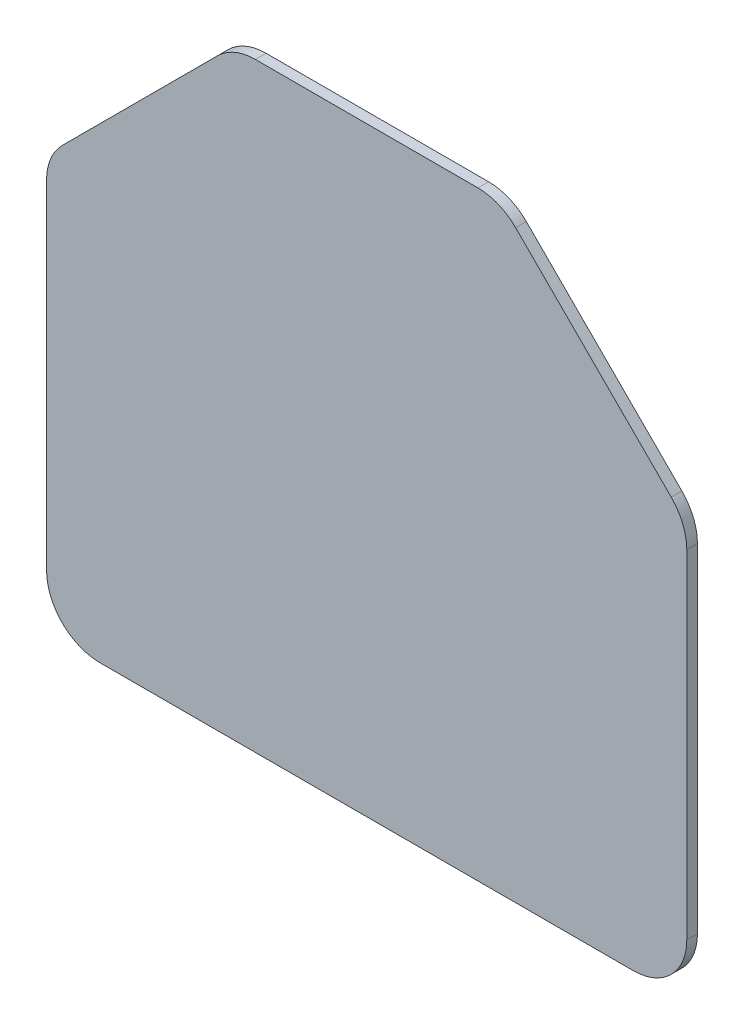
ISO-10303-21;
HEADER;
FILE_DESCRIPTION(('STEP AP214'),'2;1');
FILE_NAME('part.step','',(''),(''),'','','');
FILE_SCHEMA(('AUTOMOTIVE_DESIGN { 1 0 10303 214 1 1 1 1 }'));
ENDSEC;
DATA;
#1=APPLICATION_CONTEXT('core data for automotive mechanical design processes');
#2=APPLICATION_PROTOCOL_DEFINITION('international standard','automotive_design',2000,#1);
#3=PRODUCT_CONTEXT('',#1,'mechanical');
#4=PRODUCT('Part','Part','',(#3));
#5=PRODUCT_RELATED_PRODUCT_CATEGORY('part','',(#4));
#6=PRODUCT_DEFINITION_FORMATION('','',#4);
#7=PRODUCT_DEFINITION_CONTEXT('part definition',#1,'design');
#8=PRODUCT_DEFINITION('design','',#6,#7);
#9=PRODUCT_DEFINITION_SHAPE('','',#8);
#10=(LENGTH_UNIT() NAMED_UNIT(*) SI_UNIT(.MILLI.,.METRE.));
#11=(NAMED_UNIT(*) PLANE_ANGLE_UNIT() SI_UNIT($,.RADIAN.));
#12=(NAMED_UNIT(*) SI_UNIT($,.STERADIAN.) SOLID_ANGLE_UNIT());
#13=UNCERTAINTY_MEASURE_WITH_UNIT(LENGTH_MEASURE(1.E-05),#10,'distance_accuracy_value','');
#14=(GEOMETRIC_REPRESENTATION_CONTEXT(3) GLOBAL_UNCERTAINTY_ASSIGNED_CONTEXT((#13)) GLOBAL_UNIT_ASSIGNED_CONTEXT((#10,
#11,#12)) REPRESENTATION_CONTEXT('',''));
#15=CARTESIAN_POINT('',(0.,0.,0.));
#16=DIRECTION('',(0.,0.,1.));
#17=DIRECTION('',(1.,0.,0.));
#18=AXIS2_PLACEMENT_3D('',#15,#16,#17);
#19=CARTESIAN_POINT('',(73.5057465651856,239.089488009277,4.));
#20=DIRECTION('',(0.,0.,-1.));
#21=DIRECTION('',(-1.,0.,0.));
#22=AXIS2_PLACEMENT_3D('',#19,#20,#21);
#23=CYLINDRICAL_SURFACE('',#22,20.);
#24=CARTESIAN_POINT('',(73.5057465651856,239.089488009277,0.));
#25=DIRECTION('',(0.,0.,1.));
#26=DIRECTION('',(1.,0.,0.));
#27=AXIS2_PLACEMENT_3D('',#24,#25,#26);
#28=CIRCLE('',#27,20.);
#29=CARTESIAN_POINT('',(73.5057465651857,259.089488009277,0.));
#30=VERTEX_POINT('',#29);
#31=CARTESIAN_POINT('',(59.3636109414546,253.231623633008,0.));
#32=VERTEX_POINT('',#31);
#33=EDGE_CURVE('E154',#30,#32,#28,.T.);
#34=ORIENTED_EDGE('',*,*,#33,.T.);
#35=DIRECTION('',(0.,0.,-1.));
#36=VECTOR('',#35,1.);
#37=CARTESIAN_POINT('',(59.3636109414546,253.231623633008,4.));
#38=LINE('',#37,#36);
#39=CARTESIAN_POINT('',(59.3636109414546,253.231623633008,4.));
#40=VERTEX_POINT('',#39);
#41=EDGE_CURVE('E11',#40,#32,#38,.T.);
#42=ORIENTED_EDGE('',*,*,#41,.F.);
#43=CARTESIAN_POINT('',(73.5057465651856,239.089488009277,4.));
#44=DIRECTION('',(0.,0.,1.));
#45=DIRECTION('',(1.,0.,0.));
#46=AXIS2_PLACEMENT_3D('',#43,#44,#45);
#47=CIRCLE('',#46,20.);
#48=CARTESIAN_POINT('',(73.5057465651857,259.089488009277,4.));
#49=VERTEX_POINT('',#48);
#50=EDGE_CURVE('E176',#49,#40,#47,.T.);
#51=ORIENTED_EDGE('',*,*,#50,.F.);
#52=DIRECTION('',(0.,0.,-1.));
#53=VECTOR('',#52,1.);
#54=CARTESIAN_POINT('',(73.5057465651857,259.089488009277,4.));
#55=LINE('',#54,#53);
#56=EDGE_CURVE('E150',#49,#30,#55,.T.);
#57=ORIENTED_EDGE('',*,*,#56,.T.);
#58=EDGE_LOOP('',(#34,#42,#51,#57));
#59=FACE_BOUND('',#58,.T.);
#60=ADVANCED_FACE('F34',(#59),#23,.T.);
#61=CARTESIAN_POINT('',(1.07933969399285,194.947352385546,4.));
#62=DIRECTION('',(0.707106781186547,-0.707106781186548,0.));
#63=DIRECTION('',(0.707106781186548,0.707106781186547,0.));
#64=AXIS2_PLACEMENT_3D('',#61,#62,#63);
#65=PLANE('',#64);
#66=DIRECTION('',(-0.707106781186548,-0.707106781186547,0.));
#67=VECTOR('',#66,1.);
#68=CARTESIAN_POINT('',(1.07933969399285,194.947352385546,0.));
#69=LINE('',#68,#67);
#70=CARTESIAN_POINT('',(1.07933969399284,194.947352385546,0.));
#71=VERTEX_POINT('',#70);
#72=EDGE_CURVE('E157',#32,#71,#69,.T.);
#73=ORIENTED_EDGE('',*,*,#72,.T.);
#74=DIRECTION('',(0.,0.,-1.));
#75=VECTOR('',#74,1.);
#76=CARTESIAN_POINT('',(1.07933969399284,194.947352385546,4.));
#77=LINE('',#76,#75);
#78=CARTESIAN_POINT('',(1.07933969399284,194.947352385546,4.));
#79=VERTEX_POINT('',#78);
#80=EDGE_CURVE('E42',#79,#71,#77,.T.);
#81=ORIENTED_EDGE('',*,*,#80,.F.);
#82=DIRECTION('',(-0.707106781186548,-0.707106781186547,0.));
#83=VECTOR('',#82,1.);
#84=CARTESIAN_POINT('',(1.07933969399285,194.947352385546,4.));
#85=LINE('',#84,#83);
#86=EDGE_CURVE('E105',#40,#79,#85,.T.);
#87=ORIENTED_EDGE('',*,*,#86,.F.);
#88=ORIENTED_EDGE('',*,*,#41,.T.);
#89=EDGE_LOOP('',(#73,#81,#87,#88));
#90=FACE_BOUND('',#89,.T.);
#91=ADVANCED_FACE('F254',(#90),#65,.F.);
#92=CARTESIAN_POINT('',(15.2214753177237,180.805216761815,4.));
#93=DIRECTION('',(0.,0.,-1.));
#94=DIRECTION('',(-1.,0.,0.));
#95=AXIS2_PLACEMENT_3D('',#92,#93,#94);
#96=CYLINDRICAL_SURFACE('',#95,20.);
#97=CARTESIAN_POINT('',(15.2214753177237,180.805216761815,0.));
#98=DIRECTION('',(0.,0.,1.));
#99=DIRECTION('',(1.,0.,0.));
#100=AXIS2_PLACEMENT_3D('',#97,#98,#99);
#101=CIRCLE('',#100,20.);
#102=CARTESIAN_POINT('',(-4.77852468227626,180.805216761815,0.));
#103=VERTEX_POINT('',#102);
#104=EDGE_CURVE('E159',#71,#103,#101,.T.);
#105=ORIENTED_EDGE('',*,*,#104,.T.);
#106=DIRECTION('',(0.,0.,-1.));
#107=VECTOR('',#106,1.);
#108=CARTESIAN_POINT('',(-4.77852468227626,180.805216761815,4.));
#109=LINE('',#108,#107);
#110=CARTESIAN_POINT('',(-4.77852468227626,180.805216761815,4.));
#111=VERTEX_POINT('',#110);
#112=EDGE_CURVE('E195',#111,#103,#109,.T.);
#113=ORIENTED_EDGE('',*,*,#112,.F.);
#114=CARTESIAN_POINT('',(15.2214753177237,180.805216761815,4.));
#115=DIRECTION('',(0.,0.,1.));
#116=DIRECTION('',(1.,0.,0.));
#117=AXIS2_PLACEMENT_3D('',#114,#115,#116);
#118=CIRCLE('',#117,20.);
#119=EDGE_CURVE('E203',#79,#111,#118,.T.);
#120=ORIENTED_EDGE('',*,*,#119,.F.);
#121=ORIENTED_EDGE('',*,*,#80,.T.);
#122=EDGE_LOOP('',(#105,#113,#120,#121));
#123=FACE_BOUND('',#122,.T.);
#124=ADVANCED_FACE('F201',(#123),#96,.T.);
#125=CARTESIAN_POINT('',(-4.77852468227626,180.805216761815,4.));
#126=DIRECTION('',(1.,0.,0.));
#127=DIRECTION('',(0.,1.,0.));
#128=AXIS2_PLACEMENT_3D('',#125,#126,#127);
#129=PLANE('',#128);
#130=DIRECTION('',(0.,-1.,0.));
#131=VECTOR('',#130,1.);
#132=CARTESIAN_POINT('',(-4.77852468227626,180.805216761815,0.));
#133=LINE('',#132,#131);
#134=CARTESIAN_POINT('',(-4.77852468227625,54.0894880092774,0.));
#135=VERTEX_POINT('',#134);
#136=EDGE_CURVE('E161',#103,#135,#133,.T.);
#137=ORIENTED_EDGE('',*,*,#136,.T.);
#138=DIRECTION('',(0.,0.,-1.));
#139=VECTOR('',#138,1.);
#140=CARTESIAN_POINT('',(-4.77852468227625,54.0894880092774,4.));
#141=LINE('',#140,#139);
#142=CARTESIAN_POINT('',(-4.77852468227625,54.0894880092774,4.));
#143=VERTEX_POINT('',#142);
#144=EDGE_CURVE('E192',#143,#135,#141,.T.);
#145=ORIENTED_EDGE('',*,*,#144,.F.);
#146=DIRECTION('',(0.,-1.,0.));
#147=VECTOR('',#146,1.);
#148=CARTESIAN_POINT('',(-4.77852468227626,180.805216761815,4.));
#149=LINE('',#148,#147);
#150=EDGE_CURVE('E221',#111,#143,#149,.T.);
#151=ORIENTED_EDGE('',*,*,#150,.F.);
#152=ORIENTED_EDGE('',*,*,#112,.T.);
#153=EDGE_LOOP('',(#137,#145,#151,#152));
#154=FACE_BOUND('',#153,.T.);
#155=ADVANCED_FACE('F212',(#154),#129,.F.);
#156=CARTESIAN_POINT('',(15.2214753177238,54.0894880092772,4.));
#157=DIRECTION('',(0.,0.,-1.));
#158=DIRECTION('',(-1.,0.,0.));
#159=AXIS2_PLACEMENT_3D('',#156,#157,#158);
#160=CYLINDRICAL_SURFACE('',#159,20.);
#161=CARTESIAN_POINT('',(15.2214753177238,54.0894880092772,0.));
#162=DIRECTION('',(0.,0.,1.));
#163=DIRECTION('',(1.,0.,0.));
#164=AXIS2_PLACEMENT_3D('',#161,#162,#163);
#165=CIRCLE('',#164,20.);
#166=CARTESIAN_POINT('',(15.2214753177239,34.0894880092772,0.));
#167=VERTEX_POINT('',#166);
#168=EDGE_CURVE('E163',#135,#167,#165,.T.);
#169=ORIENTED_EDGE('',*,*,#168,.T.);
#170=DIRECTION('',(0.,0.,-1.));
#171=VECTOR('',#170,1.);
#172=CARTESIAN_POINT('',(15.2214753177239,34.0894880092772,4.));
#173=LINE('',#172,#171);
#174=CARTESIAN_POINT('',(15.2214753177239,34.0894880092772,4.));
#175=VERTEX_POINT('',#174);
#176=EDGE_CURVE('E189',#175,#167,#173,.T.);
#177=ORIENTED_EDGE('',*,*,#176,.F.);
#178=CARTESIAN_POINT('',(15.2214753177238,54.0894880092772,4.));
#179=DIRECTION('',(0.,0.,1.));
#180=DIRECTION('',(1.,0.,0.));
#181=AXIS2_PLACEMENT_3D('',#178,#179,#180);
#182=CIRCLE('',#181,20.);
#183=EDGE_CURVE('E218',#143,#175,#182,.T.);
#184=ORIENTED_EDGE('',*,*,#183,.F.);
#185=ORIENTED_EDGE('',*,*,#144,.T.);
#186=EDGE_LOOP('',(#169,#177,#184,#185));
#187=FACE_BOUND('',#186,.T.);
#188=ADVANCED_FACE('F216',(#187),#160,.T.);
#189=CARTESIAN_POINT('',(15.2214753177239,34.0894880092772,4.));
#190=DIRECTION('',(0.,1.,0.));
#191=DIRECTION('',(0.,0.,1.));
#192=AXIS2_PLACEMENT_3D('',#189,#190,#191);
#193=PLANE('',#192);
#194=DIRECTION('',(1.,0.,0.));
#195=VECTOR('',#194,1.);
#196=CARTESIAN_POINT('',(15.2214753177239,34.0894880092772,0.));
#197=LINE('',#196,#195);
#198=CARTESIAN_POINT('',(215.221475317724,34.0894880092772,0.));
#199=VERTEX_POINT('',#198);
#200=EDGE_CURVE('E165',#167,#199,#197,.T.);
#201=ORIENTED_EDGE('',*,*,#200,.T.);
#202=DIRECTION('',(0.,0.,-1.));
#203=VECTOR('',#202,1.);
#204=CARTESIAN_POINT('',(215.221475317724,34.0894880092772,4.));
#205=LINE('',#204,#203);
#206=CARTESIAN_POINT('',(215.221475317724,34.0894880092772,4.));
#207=VERTEX_POINT('',#206);
#208=EDGE_CURVE('E186',#207,#199,#205,.T.);
#209=ORIENTED_EDGE('',*,*,#208,.F.);
#210=DIRECTION('',(1.,0.,0.));
#211=VECTOR('',#210,1.);
#212=CARTESIAN_POINT('',(15.2214753177239,34.0894880092772,4.));
#213=LINE('',#212,#211);
#214=EDGE_CURVE('E220',#175,#207,#213,.T.);
#215=ORIENTED_EDGE('',*,*,#214,.F.);
#216=ORIENTED_EDGE('',*,*,#176,.T.);
#217=EDGE_LOOP('',(#201,#209,#215,#216));
#218=FACE_BOUND('',#217,.T.);
#219=ADVANCED_FACE('F267',(#218),#193,.F.);
#220=CARTESIAN_POINT('',(215.221475317724,54.0894880092772,4.));
#221=DIRECTION('',(0.,0.,-1.));
#222=DIRECTION('',(-1.,0.,0.));
#223=AXIS2_PLACEMENT_3D('',#220,#221,#222);
#224=CYLINDRICAL_SURFACE('',#223,20.);
#225=CARTESIAN_POINT('',(215.221475317724,54.0894880092772,0.));
#226=DIRECTION('',(0.,0.,1.));
#227=DIRECTION('',(1.,0.,0.));
#228=AXIS2_PLACEMENT_3D('',#225,#226,#227);
#229=CIRCLE('',#228,20.);
#230=CARTESIAN_POINT('',(235.221475317724,54.0894880092774,0.));
#231=VERTEX_POINT('',#230);
#232=EDGE_CURVE('E167',#199,#231,#229,.T.);
#233=ORIENTED_EDGE('',*,*,#232,.T.);
#234=DIRECTION('',(0.,0.,-1.));
#235=VECTOR('',#234,1.);
#236=CARTESIAN_POINT('',(235.221475317724,54.0894880092774,4.));
#237=LINE('',#236,#235);
#238=CARTESIAN_POINT('',(235.221475317724,54.0894880092774,4.));
#239=VERTEX_POINT('',#238);
#240=EDGE_CURVE('E183',#239,#231,#237,.T.);
#241=ORIENTED_EDGE('',*,*,#240,.F.);
#242=CARTESIAN_POINT('',(215.221475317724,54.0894880092772,4.));
#243=DIRECTION('',(0.,0.,1.));
#244=DIRECTION('',(1.,0.,0.));
#245=AXIS2_PLACEMENT_3D('',#242,#243,#244);
#246=CIRCLE('',#245,20.);
#247=EDGE_CURVE('E223',#207,#239,#246,.T.);
#248=ORIENTED_EDGE('',*,*,#247,.F.);
#249=ORIENTED_EDGE('',*,*,#208,.T.);
#250=EDGE_LOOP('',(#233,#241,#248,#249));
#251=FACE_BOUND('',#250,.T.);
#252=ADVANCED_FACE('F270',(#251),#224,.T.);
#253=CARTESIAN_POINT('',(235.221475317724,180.805216761815,4.));
#254=DIRECTION('',(-1.,0.,0.));
#255=DIRECTION('',(0.,-1.,0.));
#256=AXIS2_PLACEMENT_3D('',#253,#254,#255);
#257=PLANE('',#256);
#258=DIRECTION('',(0.,1.,0.));
#259=VECTOR('',#258,1.);
#260=CARTESIAN_POINT('',(235.221475317724,180.805216761815,0.));
#261=LINE('',#260,#259);
#262=CARTESIAN_POINT('',(235.221475317724,180.805216761815,0.));
#263=VERTEX_POINT('',#262);
#264=EDGE_CURVE('E169',#231,#263,#261,.T.);
#265=ORIENTED_EDGE('',*,*,#264,.T.);
#266=DIRECTION('',(0.,0.,-1.));
#267=VECTOR('',#266,1.);
#268=CARTESIAN_POINT('',(235.221475317724,180.805216761815,4.));
#269=LINE('',#268,#267);
#270=CARTESIAN_POINT('',(235.221475317724,180.805216761815,4.));
#271=VERTEX_POINT('',#270);
#272=EDGE_CURVE('E180',#271,#263,#269,.T.);
#273=ORIENTED_EDGE('',*,*,#272,.F.);
#274=DIRECTION('',(0.,1.,0.));
#275=VECTOR('',#274,1.);
#276=CARTESIAN_POINT('',(235.221475317724,180.805216761815,4.));
#277=LINE('',#276,#275);
#278=EDGE_CURVE('E229',#239,#271,#277,.T.);
#279=ORIENTED_EDGE('',*,*,#278,.F.);
#280=ORIENTED_EDGE('',*,*,#240,.T.);
#281=EDGE_LOOP('',(#265,#273,#279,#280));
#282=FACE_BOUND('',#281,.T.);
#283=ADVANCED_FACE('F235',(#282),#257,.F.);
#284=CARTESIAN_POINT('',(215.221475317724,180.805216761815,4.));
#285=DIRECTION('',(0.,0.,-1.));
#286=DIRECTION('',(-1.,0.,0.));
#287=AXIS2_PLACEMENT_3D('',#284,#285,#286);
#288=CYLINDRICAL_SURFACE('',#287,20.);
#289=CARTESIAN_POINT('',(215.221475317724,180.805216761815,0.));
#290=DIRECTION('',(0.,0.,1.));
#291=DIRECTION('',(1.,0.,0.));
#292=AXIS2_PLACEMENT_3D('',#289,#290,#291);
#293=CIRCLE('',#292,20.);
#294=CARTESIAN_POINT('',(229.363610941455,194.947352385546,0.));
#295=VERTEX_POINT('',#294);
#296=EDGE_CURVE('E171',#263,#295,#293,.T.);
#297=ORIENTED_EDGE('',*,*,#296,.T.);
#298=DIRECTION('',(0.,0.,-1.));
#299=VECTOR('',#298,1.);
#300=CARTESIAN_POINT('',(229.363610941455,194.947352385546,4.));
#301=LINE('',#300,#299);
#302=CARTESIAN_POINT('',(229.363610941455,194.947352385546,4.));
#303=VERTEX_POINT('',#302);
#304=EDGE_CURVE('E145',#303,#295,#301,.T.);
#305=ORIENTED_EDGE('',*,*,#304,.F.);
#306=CARTESIAN_POINT('',(215.221475317724,180.805216761815,4.));
#307=DIRECTION('',(0.,0.,1.));
#308=DIRECTION('',(1.,0.,0.));
#309=AXIS2_PLACEMENT_3D('',#306,#307,#308);
#310=CIRCLE('',#309,20.);
#311=EDGE_CURVE('E136',#271,#303,#310,.T.);
#312=ORIENTED_EDGE('',*,*,#311,.F.);
#313=ORIENTED_EDGE('',*,*,#272,.T.);
#314=EDGE_LOOP('',(#297,#305,#312,#313));
#315=FACE_BOUND('',#314,.T.);
#316=ADVANCED_FACE('F239',(#315),#288,.T.);
#317=CARTESIAN_POINT('',(171.079339693993,253.231623633008,4.));
#318=DIRECTION('',(-0.707106781186547,-0.707106781186547,0.));
#319=DIRECTION('',(0.707106781186548,-0.707106781186548,0.));
#320=AXIS2_PLACEMENT_3D('',#317,#318,#319);
#321=PLANE('',#320);
#322=DIRECTION('',(-0.707106781186548,0.707106781186548,0.));
#323=VECTOR('',#322,1.);
#324=CARTESIAN_POINT('',(171.079339693993,253.231623633008,0.));
#325=LINE('',#324,#323);
#326=CARTESIAN_POINT('',(171.079339693993,253.231623633008,0.));
#327=VERTEX_POINT('',#326);
#328=EDGE_CURVE('E144',#295,#327,#325,.T.);
#329=ORIENTED_EDGE('',*,*,#328,.T.);
#330=DIRECTION('',(0.,0.,-1.));
#331=VECTOR('',#330,1.);
#332=CARTESIAN_POINT('',(171.079339693993,253.231623633008,4.));
#333=LINE('',#332,#331);
#334=CARTESIAN_POINT('',(171.079339693993,253.231623633008,4.));
#335=VERTEX_POINT('',#334);
#336=EDGE_CURVE('E141',#335,#327,#333,.T.);
#337=ORIENTED_EDGE('',*,*,#336,.F.);
#338=DIRECTION('',(-0.707106781186548,0.707106781186548,0.));
#339=VECTOR('',#338,1.);
#340=CARTESIAN_POINT('',(171.079339693993,253.231623633008,4.));
#341=LINE('',#340,#339);
#342=EDGE_CURVE('E130',#303,#335,#341,.T.);
#343=ORIENTED_EDGE('',*,*,#342,.F.);
#344=ORIENTED_EDGE('',*,*,#304,.T.);
#345=EDGE_LOOP('',(#329,#337,#343,#344));
#346=FACE_BOUND('',#345,.T.);
#347=ADVANCED_FACE('F142',(#346),#321,.F.);
#348=CARTESIAN_POINT('',(156.937204070262,239.089488009277,4.));
#349=DIRECTION('',(0.,0.,-1.));
#350=DIRECTION('',(-1.,0.,0.));
#351=AXIS2_PLACEMENT_3D('',#348,#349,#350);
#352=CYLINDRICAL_SURFACE('',#351,20.);
#353=CARTESIAN_POINT('',(156.937204070262,239.089488009277,0.));
#354=DIRECTION('',(0.,0.,1.));
#355=DIRECTION('',(1.,0.,0.));
#356=AXIS2_PLACEMENT_3D('',#353,#354,#355);
#357=CIRCLE('',#356,20.);
#358=CARTESIAN_POINT('',(156.937204070262,259.089488009277,0.));
#359=VERTEX_POINT('',#358);
#360=EDGE_CURVE('E91',#327,#359,#357,.T.);
#361=ORIENTED_EDGE('',*,*,#360,.T.);
#362=DIRECTION('',(0.,0.,-1.));
#363=VECTOR('',#362,1.);
#364=CARTESIAN_POINT('',(156.937204070262,259.089488009277,4.));
#365=LINE('',#364,#363);
#366=CARTESIAN_POINT('',(156.937204070262,259.089488009277,4.));
#367=VERTEX_POINT('',#366);
#368=EDGE_CURVE('E146',#367,#359,#365,.T.);
#369=ORIENTED_EDGE('',*,*,#368,.F.);
#370=CARTESIAN_POINT('',(156.937204070262,239.089488009277,4.));
#371=DIRECTION('',(0.,0.,1.));
#372=DIRECTION('',(1.,0.,0.));
#373=AXIS2_PLACEMENT_3D('',#370,#371,#372);
#374=CIRCLE('',#373,20.);
#375=EDGE_CURVE('E134',#335,#367,#374,.T.);
#376=ORIENTED_EDGE('',*,*,#375,.F.);
#377=ORIENTED_EDGE('',*,*,#336,.T.);
#378=EDGE_LOOP('',(#361,#369,#376,#377));
#379=FACE_BOUND('',#378,.T.);
#380=ADVANCED_FACE('F148',(#379),#352,.T.);
#381=CARTESIAN_POINT('',(73.5057465651857,259.089488009277,4.));
#382=DIRECTION('',(0.,-1.,0.));
#383=DIRECTION('',(0.,0.,-1.));
#384=AXIS2_PLACEMENT_3D('',#381,#382,#383);
#385=PLANE('',#384);
#386=DIRECTION('',(-1.,0.,0.));
#387=VECTOR('',#386,1.);
#388=CARTESIAN_POINT('',(73.5057465651857,259.089488009277,0.));
#389=LINE('',#388,#387);
#390=EDGE_CURVE('E97',#359,#30,#389,.T.);
#391=ORIENTED_EDGE('',*,*,#390,.T.);
#392=ORIENTED_EDGE('',*,*,#56,.F.);
#393=DIRECTION('',(-1.,0.,0.));
#394=VECTOR('',#393,1.);
#395=CARTESIAN_POINT('',(73.5057465651857,259.089488009277,4.));
#396=LINE('',#395,#394);
#397=EDGE_CURVE('E50',#367,#49,#396,.T.);
#398=ORIENTED_EDGE('',*,*,#397,.F.);
#399=ORIENTED_EDGE('',*,*,#368,.T.);
#400=EDGE_LOOP('',(#391,#392,#398,#399));
#401=FACE_BOUND('',#400,.T.);
#402=ADVANCED_FACE('F243',(#401),#385,.F.);
#403=CARTESIAN_POINT('',(73.5057465651856,239.089488009277,4.));
#404=DIRECTION('',(0.,0.,1.));
#405=DIRECTION('',(1.,0.,0.));
#406=AXIS2_PLACEMENT_3D('',#403,#404,#405);
#407=PLANE('',#406);
#408=ORIENTED_EDGE('',*,*,#50,.T.);
#409=ORIENTED_EDGE('',*,*,#86,.T.);
#410=ORIENTED_EDGE('',*,*,#119,.T.);
#411=ORIENTED_EDGE('',*,*,#150,.T.);
#412=ORIENTED_EDGE('',*,*,#183,.T.);
#413=ORIENTED_EDGE('',*,*,#214,.T.);
#414=ORIENTED_EDGE('',*,*,#247,.T.);
#415=ORIENTED_EDGE('',*,*,#278,.T.);
#416=ORIENTED_EDGE('',*,*,#311,.T.);
#417=ORIENTED_EDGE('',*,*,#342,.T.);
#418=ORIENTED_EDGE('',*,*,#375,.T.);
#419=ORIENTED_EDGE('',*,*,#397,.T.);
#420=EDGE_LOOP('',(#408,#409,#410,#411,#412,#413,#414,#415,#416,#417,#418,#419));
#421=FACE_BOUND('',#420,.T.);
#422=ADVANCED_FACE('F132',(#421),#407,.T.);
#423=CARTESIAN_POINT('',(73.5057465651856,239.089488009277,0.));
#424=DIRECTION('',(0.,0.,1.));
#425=DIRECTION('',(1.,0.,0.));
#426=AXIS2_PLACEMENT_3D('',#423,#424,#425);
#427=PLANE('',#426);
#428=ORIENTED_EDGE('',*,*,#33,.F.);
#429=ORIENTED_EDGE('',*,*,#390,.F.);
#430=ORIENTED_EDGE('',*,*,#360,.F.);
#431=ORIENTED_EDGE('',*,*,#328,.F.);
#432=ORIENTED_EDGE('',*,*,#296,.F.);
#433=ORIENTED_EDGE('',*,*,#264,.F.);
#434=ORIENTED_EDGE('',*,*,#232,.F.);
#435=ORIENTED_EDGE('',*,*,#200,.F.);
#436=ORIENTED_EDGE('',*,*,#168,.F.);
#437=ORIENTED_EDGE('',*,*,#136,.F.);
#438=ORIENTED_EDGE('',*,*,#104,.F.);
#439=ORIENTED_EDGE('',*,*,#72,.F.);
#440=EDGE_LOOP('',(#428,#429,#430,#431,#432,#433,#434,#435,#436,#437,#438,#439));
#441=FACE_BOUND('',#440,.T.);
#442=ADVANCED_FACE('F207',(#441),#427,.F.);
#443=CLOSED_SHELL('',(#60,#91,#124,#155,#188,#219,#252,#283,#316,#347,#380,#402,#422,#442));
#444=MANIFOLD_SOLID_BREP('B2',#443);
#445=ADVANCED_BREP_SHAPE_REPRESENTATION('',(#18,#444),#14);
#446=SHAPE_DEFINITION_REPRESENTATION(#9,#445);
ENDSEC;
END-ISO-10303-21;
